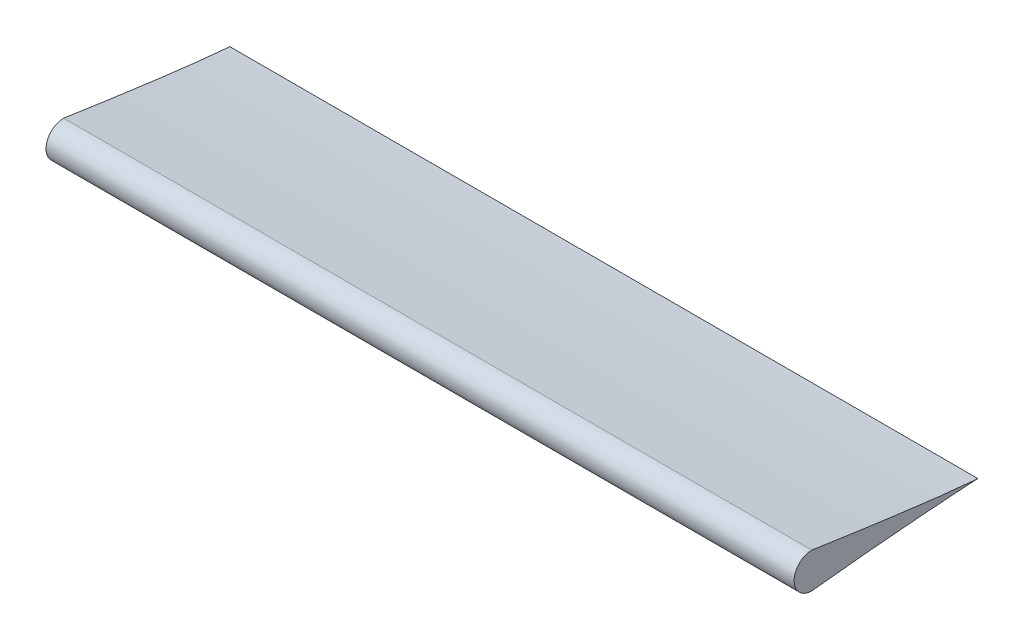
ISO-10303-21;
HEADER;
FILE_DESCRIPTION(('STEP AP214'),'2;1');
FILE_NAME('part.step','',(''),(''),'','','');
FILE_SCHEMA(('AUTOMOTIVE_DESIGN { 1 0 10303 214 1 1 1 1 }'));
ENDSEC;
DATA;
#1=APPLICATION_CONTEXT('core data for automotive mechanical design processes');
#2=APPLICATION_PROTOCOL_DEFINITION('international standard','automotive_design',2000,#1);
#3=PRODUCT_CONTEXT('',#1,'mechanical');
#4=PRODUCT('Part','Part','',(#3));
#5=PRODUCT_RELATED_PRODUCT_CATEGORY('part','',(#4));
#6=PRODUCT_DEFINITION_FORMATION('','',#4);
#7=PRODUCT_DEFINITION_CONTEXT('part definition',#1,'design');
#8=PRODUCT_DEFINITION('design','',#6,#7);
#9=PRODUCT_DEFINITION_SHAPE('','',#8);
#10=(LENGTH_UNIT() NAMED_UNIT(*) SI_UNIT(.MILLI.,.METRE.));
#11=(NAMED_UNIT(*) PLANE_ANGLE_UNIT() SI_UNIT($,.RADIAN.));
#12=(NAMED_UNIT(*) SI_UNIT($,.STERADIAN.) SOLID_ANGLE_UNIT());
#13=UNCERTAINTY_MEASURE_WITH_UNIT(LENGTH_MEASURE(1.E-05),#10,'distance_accuracy_value','');
#14=(GEOMETRIC_REPRESENTATION_CONTEXT(3) GLOBAL_UNCERTAINTY_ASSIGNED_CONTEXT((#13)) GLOBAL_UNIT_ASSIGNED_CONTEXT((#10,
#11,#12)) REPRESENTATION_CONTEXT('',''));
#15=CARTESIAN_POINT('',(0.,0.,0.));
#16=DIRECTION('',(0.,0.,1.));
#17=DIRECTION('',(1.,0.,0.));
#18=AXIS2_PLACEMENT_3D('',#15,#16,#17);
#19=CARTESIAN_POINT('',(-1040.,2.7242380078239,-0.666894321440181));
#20=DIRECTION('',(-1.,0.,0.));
#21=DIRECTION('',(0.,0.,1.));
#22=AXIS2_PLACEMENT_3D('',#19,#20,#21);
#23=PLANE('',#22);
#24=CARTESIAN_POINT('',(-1040.,5.86071638027736,-346.600000000001));
#25=CARTESIAN_POINT('',(-1040.,5.86942153305414,-346.597852480932));
#26=CARTESIAN_POINT('',(-1040.,5.95408700484384,-345.167167538133));
#27=CARTESIAN_POINT('',(-1040.,6.12770380231337,-343.71030351356));
#28=CARTESIAN_POINT('',(-1040.,6.43081864272421,-340.207816876405));
#29=CARTESIAN_POINT('',(-1040.,6.87325921714072,-335.907670847587));
#30=CARTESIAN_POINT('',(-1040.,7.49275086256784,-330.292953697324));
#31=CARTESIAN_POINT('',(-1040.,8.2740844505515,-323.659553652556));
#32=CARTESIAN_POINT('',(-1040.,9.24327014430082,-316.002511078225));
#33=CARTESIAN_POINT('',(-1040.,10.3815705655346,-307.429551377501));
#34=CARTESIAN_POINT('',(-1040.,11.6833030342219,-298.018680009203));
#35=CARTESIAN_POINT('',(-1040.,13.1368804000074,-287.863702409179));
#36=CARTESIAN_POINT('',(-1040.,14.7182033722859,-277.059643778127));
#37=CARTESIAN_POINT('',(-1040.,16.4008254095122,-265.704765677718));
#38=CARTESIAN_POINT('',(-1040.,18.1406788919494,-253.896097473474));
#39=CARTESIAN_POINT('',(-1040.,19.9192377434933,-241.737250017814));
#40=CARTESIAN_POINT('',(-1040.,21.6563318290564,-229.327440834419));
#41=CARTESIAN_POINT('',(-1040.,23.3337080476179,-216.762528701424));
#42=CARTESIAN_POINT('',(-1040.,24.7772271585556,-204.073884670746));
#43=CARTESIAN_POINT('',(-1040.,25.9228413259878,-191.282522577713));
#44=CARTESIAN_POINT('',(-1040.,26.8745966143027,-178.425425999593));
#45=CARTESIAN_POINT('',(-1040.,27.5954369967736,-165.549012826765));
#46=CARTESIAN_POINT('',(-1040.,28.088486879693,-152.725859519747));
#47=CARTESIAN_POINT('',(-1040.,28.3788067662138,-140.023357060786));
#48=CARTESIAN_POINT('',(-1040.,28.4385181896698,-127.510045631155));
#49=CARTESIAN_POINT('',(-1040.,28.2957815085234,-115.254313713338));
#50=CARTESIAN_POINT('',(-1040.,27.9345770933286,-103.323214561727));
#51=CARTESIAN_POINT('',(-1040.,27.377464880577,-91.7878334113469));
#52=CARTESIAN_POINT('',(-1040.,26.6199481784096,-80.7121418120204));
#53=CARTESIAN_POINT('',(-1040.,25.6837634702586,-70.1628154750461));
#54=CARTESIAN_POINT('',(-1040.,24.5593112665133,-60.2034081504018));
#55=CARTESIAN_POINT('',(-1040.,23.2663130962177,-50.8913221894429));
#56=CARTESIAN_POINT('',(-1040.,21.7863228253272,-42.2808453554841));
#57=CARTESIAN_POINT('',(-1040.,20.1573279635737,-34.4120212721913));
#58=CARTESIAN_POINT('',(-1040.,18.335760386343,-27.3199916589574));
#59=CARTESIAN_POINT('',(-1040.,16.3210120421331,-21.030633492362));
#60=CARTESIAN_POINT('',(-1040.,14.2018530313749,-15.5314824382831));
#61=CARTESIAN_POINT('',(-1040.,11.9569242277192,-10.8536593210112));
#62=CARTESIAN_POINT('',(-1040.,9.65350487933525,-7.00869240132422));
#63=CARTESIAN_POINT('',(-1040.,7.32149117441311,-3.99127209384448));
#64=CARTESIAN_POINT('',(-1040.,4.91734468115579,-1.82192325647609));
#65=CARTESIAN_POINT('',(-1040.,2.58232434229022,-0.523442799864354));
#66=CARTESIAN_POINT('',(-1040.,0.409759015467248,0.233627416068555));
#67=CARTESIAN_POINT('',(-1040.,-1.75709273500441,-0.426579477064093));
#68=CARTESIAN_POINT('',(-1040.,-3.1977483365444,-2.53791233705558));
#69=CARTESIAN_POINT('',(-1040.,-4.65483807131861,-5.3921114462632));
#70=CARTESIAN_POINT('',(-1040.,-6.05472613804281,-9.30647814844361));
#71=CARTESIAN_POINT('',(-1040.,-7.37535584141191,-14.1602854101434));
#72=CARTESIAN_POINT('',(-1040.,-8.59209450318432,-19.955205746287));
#73=CARTESIAN_POINT('',(-1040.,-9.67784910590047,-26.6510377888111));
#74=CARTESIAN_POINT('',(-1040.,-10.6303869203228,-34.2149896306284));
#75=CARTESIAN_POINT('',(-1040.,-11.4362358704924,-42.6095526598738));
#76=CARTESIAN_POINT('',(-1040.,-12.0917115028123,-51.7866503013561));
#77=CARTESIAN_POINT('',(-1040.,-12.6014398459628,-61.6964853282173));
#78=CARTESIAN_POINT('',(-1040.,-12.9578854769249,-72.2808050911164));
#79=CARTESIAN_POINT('',(-1040.,-13.1648826289751,-83.4794397444211));
#80=CARTESIAN_POINT('',(-1040.,-13.2211833311955,-95.2244179207898));
#81=CARTESIAN_POINT('',(-1040.,-13.1327984404319,-107.44531563697));
#82=CARTESIAN_POINT('',(-1040.,-12.9039422081063,-120.06718568759));
#83=CARTESIAN_POINT('',(-1040.,-12.5386131752455,-133.010375763007));
#84=CARTESIAN_POINT('',(-1040.,-12.0446708618454,-146.192016010977));
#85=CARTESIAN_POINT('',(-1040.,-11.414340745761,-159.52633158202));
#86=CARTESIAN_POINT('',(-1040.,-10.6584041848464,-172.924472517881));
#87=CARTESIAN_POINT('',(-1040.,-9.72862479746972,-186.316724917838));
#88=CARTESIAN_POINT('',(-1040.,-8.59584787560952,-199.652839070497));
#89=CARTESIAN_POINT('',(-1040.,-7.3129207995109,-212.898223931713));
#90=CARTESIAN_POINT('',(-1040.,-5.91694220775768,-226.003657754342));
#91=CARTESIAN_POINT('',(-1040.,-4.45292645217377,-238.897774799766));
#92=CARTESIAN_POINT('',(-1040.,-2.98628782761945,-251.506843629765));
#93=CARTESIAN_POINT('',(-1040.,-1.56237335714104,-263.735084655258));
#94=CARTESIAN_POINT('',(-1040.,-0.237986920124389,-275.482068230199));
#95=CARTESIAN_POINT('',(-1040.,0.967497871551593,-286.637141689727));
#96=CARTESIAN_POINT('',(-1040.,2.03372814092395,-297.094147692606));
#97=CARTESIAN_POINT('',(-1040.,2.94760216572376,-306.753882210194));
#98=CARTESIAN_POINT('',(-1040.,3.71094189693205,-315.518201790493));
#99=CARTESIAN_POINT('',(-1040.,4.33761076632527,-323.308156110828));
#100=CARTESIAN_POINT('',(-1040.,4.82578782510346,-330.021729474098));
#101=CARTESIAN_POINT('',(-1040.,5.21956178896965,-335.69003557838));
#102=CARTESIAN_POINT('',(-1040.,5.55182594115489,-340.042163058898));
#103=CARTESIAN_POINT('',(-1040.,5.75757542524674,-343.623905570646));
#104=CARTESIAN_POINT('',(-1040.,5.87005572151089,-345.115045904188));
#105=CARTESIAN_POINT('',(-1040.,5.85182687726858,-346.602192997381));
#106=CARTESIAN_POINT('',(-1040.,5.86071638027736,-346.600000000001));
#107=B_SPLINE_CURVE_WITH_KNOTS('',3,(#24,#25,#26,#27,#28,#29,#30,#31,#32,#33,#34,#35,#36,#37,
#38,#39,#40,#41,#42,#43,#44,#45,#46,#47,#48,#49,#50,#51,#52,#53,#54,#55,#56,#57,#58,#59,#60,#61,
#62,#63,#64,#65,#66,#67,#68,#69,#70,#71,#72,#73,#74,#75,#76,#77,#78,#79,#80,#81,#82,#83,#84,#85,
#86,#87,#88,#89,#90,#91,#92,#93,#94,#95,#96,#97,#98,#99,#100,#101,#102,#103,#104,#105,#106),
.UNSPECIFIED.,.T.,.F.,(4,1,1,1,1,1,1,1,1,1,1,1,1,1,1,1,1,1,1,1,1,1,1,1,1,1,1,1,1,1,1,1,1,1,1,1,
1,1,1,1,1,1,1,1,1,1,1,1,1,1,1,1,1,1,1,1,1,1,1,1,1,1,1,1,1,1,1,1,1,1,1,1,1,1,1,1,1,1,1,1,4),(0.,
0.000971237958935089,0.00379550488941406,0.00838889713311412,0.0147108585341679,
0.0226780451151255,0.0321935893654122,0.0431578374772158,0.0554477635765267,0.0689450810748732,
0.0835209743295518,0.0990345049396833,0.115338149300278,0.132292378261073,0.149748787287016,
0.167548160817062,0.185533000847794,0.203606824322396,0.221802152219981,0.240094780419079,
0.258381325545334,0.276593840485898,0.294615696320151,0.312363136598153,0.329758285552068,
0.34668867666744,0.363076304230722,0.378823915995178,0.393853850968574,0.408070676422894,
0.421404123740081,0.433792847882556,0.445184773052429,0.455537591190034,0.464887425285465,
0.473229998593558,0.480557633281548,0.486906623799577,0.492238034051424,0.496718364977629,
0.500526341599145,0.503606091199367,0.506177592628953,0.509478573363382,0.514052138731787,
0.519911011985978,0.527046393100711,0.535434514860353,0.545049400456516,0.555862282514593,
0.56781964692456,0.58087606000333,0.594950040868561,0.609977749598367,0.625870112949949,
0.642537246695213,0.659878939874303,0.677794441934522,0.696172799529494,0.714892973853184,
0.733838964579521,0.752890035469179,0.771908418749841,0.790874705845988,0.809754599599678,
0.828447710464764,0.846871330730811,0.864890849052298,0.882382263972322,0.89917761398861,
0.915117479075331,0.930053399369896,0.943838005379903,0.956340240690094,0.967439356026097,
0.977019226998307,0.985009700423928,0.991382470548144,0.996091139759218,0.999008193999625,1.),.UNSPECIFIED.);
#108=CARTESIAN_POINT('',(-1040.,-0.0490741662546035,-277.280000000001));
#109=VERTEX_POINT('',#108);
#110=CARTESIAN_POINT('',(-1040.,14.6891266400672,-277.280000000001));
#111=VERTEX_POINT('',#110);
#112=EDGE_CURVE('E15',#109,#111,#107,.T.);
#113=ORIENTED_EDGE('',*,*,#112,.F.);
#114=CARTESIAN_POINT('',(-1040.,7.32002623690636,-277.280000000001));
#115=DIRECTION('',(-1.,0.,0.));
#116=DIRECTION('',(0.,0.,1.));
#117=AXIS2_PLACEMENT_3D('',#114,#115,#116);
#118=CIRCLE('',#117,7.36910040316079);
#119=EDGE_CURVE('E146',#109,#111,#118,.T.);
#120=ORIENTED_EDGE('',*,*,#119,.T.);
#121=EDGE_LOOP('',(#113,#120));
#122=FACE_BOUND('',#121,.T.);
#123=ADVANCED_FACE('F100',(#122),#23,.T.);
#124=CARTESIAN_POINT('',(1040.,5.86071638027729,-346.600000000002));
#125=CARTESIAN_POINT('',(1040.,5.86942153305407,-346.597852480933));
#126=CARTESIAN_POINT('',(1040.,5.95408700484373,-345.167167538133));
#127=CARTESIAN_POINT('',(1040.,6.12770380231326,-343.71030351356));
#128=CARTESIAN_POINT('',(1040.,6.4308186427241,-340.207816876405));
#129=CARTESIAN_POINT('',(1040.,6.87325921714055,-335.907670847587));
#130=CARTESIAN_POINT('',(1040.,7.49275086256784,-330.292953697324));
#131=CARTESIAN_POINT('',(1040.,8.27408445055139,-323.659553652556));
#132=CARTESIAN_POINT('',(1040.,9.24327014430082,-316.002511078225));
#133=CARTESIAN_POINT('',(1040.,10.3815705655345,-307.429551377501));
#134=CARTESIAN_POINT('',(1040.,11.6833030342218,-298.018680009203));
#135=CARTESIAN_POINT('',(1040.,13.1368804000073,-287.863702409179));
#136=CARTESIAN_POINT('',(1040.,14.7182033722859,-277.059643778127));
#137=CARTESIAN_POINT('',(1040.,16.4008254095122,-265.704765677718));
#138=CARTESIAN_POINT('',(1040.,18.1406788919493,-253.896097473474));
#139=CARTESIAN_POINT('',(1040.,19.9192377434932,-241.737250017814));
#140=CARTESIAN_POINT('',(1040.,21.6563318290564,-229.327440834419));
#141=CARTESIAN_POINT('',(1040.,23.3337080476178,-216.762528701424));
#142=CARTESIAN_POINT('',(1040.,24.7772271585557,-204.073884670746));
#143=CARTESIAN_POINT('',(1040.,25.9228413259878,-191.282522577714));
#144=CARTESIAN_POINT('',(1040.,26.8745966143026,-178.425425999593));
#145=CARTESIAN_POINT('',(1040.,27.5954369967736,-165.549012826765));
#146=CARTESIAN_POINT('',(1040.,28.088486879693,-152.725859519747));
#147=CARTESIAN_POINT('',(1040.,28.3788067662139,-140.023357060786));
#148=CARTESIAN_POINT('',(1040.,28.4385181896697,-127.510045631155));
#149=CARTESIAN_POINT('',(1040.,28.2957815085232,-115.254313713338));
#150=CARTESIAN_POINT('',(1040.,27.9345770933286,-103.323214561727));
#151=CARTESIAN_POINT('',(1040.,27.3774648805769,-91.7878334113468));
#152=CARTESIAN_POINT('',(1040.,26.6199481784094,-80.7121418120204));
#153=CARTESIAN_POINT('',(1040.,25.6837634702586,-70.1628154750461));
#154=CARTESIAN_POINT('',(1040.,24.5593112665133,-60.2034081504018));
#155=CARTESIAN_POINT('',(1040.,23.2663130962176,-50.8913221894429));
#156=CARTESIAN_POINT('',(1040.,21.7863228253272,-42.280845355484));
#157=CARTESIAN_POINT('',(1040.,20.1573279635737,-34.4120212721913));
#158=CARTESIAN_POINT('',(1040.,18.3357603863429,-27.3199916589574));
#159=CARTESIAN_POINT('',(1040.,16.321012042133,-21.0306334923619));
#160=CARTESIAN_POINT('',(1040.,14.2018530313748,-15.5314824382831));
#161=CARTESIAN_POINT('',(1040.,11.956924227719,-10.8536593210113));
#162=CARTESIAN_POINT('',(1040.,9.65350487933514,-7.00869240132422));
#163=CARTESIAN_POINT('',(1040.,7.32149117441311,-3.99127209384448));
#164=CARTESIAN_POINT('',(1040.,4.91734468115568,-1.82192325647609));
#165=CARTESIAN_POINT('',(1040.,2.58232434229011,-0.523442799864354));
#166=CARTESIAN_POINT('',(1040.,0.409759015467137,0.233627416068555));
#167=CARTESIAN_POINT('',(1040.,-1.75709273500441,-0.426579477063926));
#168=CARTESIAN_POINT('',(1040.,-3.19774833654451,-2.53791233705558));
#169=CARTESIAN_POINT('',(1040.,-4.65483807131872,-5.39211144626317));
#170=CARTESIAN_POINT('',(1040.,-6.05472613804292,-9.30647814844365));
#171=CARTESIAN_POINT('',(1040.,-7.37535584141202,-14.1602854101434));
#172=CARTESIAN_POINT('',(1040.,-8.59209450318427,-19.9552057462871));
#173=CARTESIAN_POINT('',(1040.,-9.67784910590047,-26.6510377888111));
#174=CARTESIAN_POINT('',(1040.,-10.6303869203227,-34.2149896306284));
#175=CARTESIAN_POINT('',(1040.,-11.4362358704925,-42.6095526598737));
#176=CARTESIAN_POINT('',(1040.,-12.0917115028124,-51.7866503013561));
#177=CARTESIAN_POINT('',(1040.,-12.6014398459628,-61.6964853282173));
#178=CARTESIAN_POINT('',(1040.,-12.9578854769251,-72.2808050911164));
#179=CARTESIAN_POINT('',(1040.,-13.1648826289751,-83.4794397444211));
#180=CARTESIAN_POINT('',(1040.,-13.2211833311955,-95.2244179207898));
#181=CARTESIAN_POINT('',(1040.,-13.132798440432,-107.445315636969));
#182=CARTESIAN_POINT('',(1040.,-12.9039422081063,-120.06718568759));
#183=CARTESIAN_POINT('',(1040.,-12.5386131752456,-133.010375763007));
#184=CARTESIAN_POINT('',(1040.,-12.0446708618454,-146.192016010977));
#185=CARTESIAN_POINT('',(1040.,-11.4143407457611,-159.52633158202));
#186=CARTESIAN_POINT('',(1040.,-10.6584041848465,-172.924472517881));
#187=CARTESIAN_POINT('',(1040.,-9.72862479746972,-186.316724917838));
#188=CARTESIAN_POINT('',(1040.,-8.59584787560963,-199.652839070497));
#189=CARTESIAN_POINT('',(1040.,-7.31292079951085,-212.898223931713));
#190=CARTESIAN_POINT('',(1040.,-5.91694220775768,-226.003657754342));
#191=CARTESIAN_POINT('',(1040.,-4.45292645217388,-238.897774799766));
#192=CARTESIAN_POINT('',(1040.,-2.98628782761956,-251.506843629765));
#193=CARTESIAN_POINT('',(1040.,-1.56237335714116,-263.735084655258));
#194=CARTESIAN_POINT('',(1040.,-0.237986920124444,-275.482068230199));
#195=CARTESIAN_POINT('',(1040.,0.967497871551481,-286.637141689727));
#196=CARTESIAN_POINT('',(1040.,2.03372814092395,-297.094147692606));
#197=CARTESIAN_POINT('',(1040.,2.94760216572376,-306.753882210194));
#198=CARTESIAN_POINT('',(1040.,3.71094189693194,-315.518201790493));
#199=CARTESIAN_POINT('',(1040.,4.33761076632516,-323.308156110828));
#200=CARTESIAN_POINT('',(1040.,4.82578782510334,-330.021729474099));
#201=CARTESIAN_POINT('',(1040.,5.21956178896954,-335.69003557838));
#202=CARTESIAN_POINT('',(1040.,5.55182594115478,-340.042163058898));
#203=CARTESIAN_POINT('',(1040.,5.75757542524663,-343.623905570646));
#204=CARTESIAN_POINT('',(1040.,5.87005572151078,-345.115045904188));
#205=CARTESIAN_POINT('',(1040.,5.85182687726851,-346.602192997381));
#206=CARTESIAN_POINT('',(1040.,5.86071638027729,-346.600000000002));
#207=B_SPLINE_CURVE_WITH_KNOTS('',3,(#124,#125,#126,#127,#128,#129,#130,#131,#132,#133,#134,
#135,#136,#137,#138,#139,#140,#141,#142,#143,#144,#145,#146,#147,#148,#149,#150,#151,#152,#153,
#154,#155,#156,#157,#158,#159,#160,#161,#162,#163,#164,#165,#166,#167,#168,#169,#170,#171,#172,
#173,#174,#175,#176,#177,#178,#179,#180,#181,#182,#183,#184,#185,#186,#187,#188,#189,#190,#191,
#192,#193,#194,#195,#196,#197,#198,#199,#200,#201,#202,#203,#204,#205,#206),.UNSPECIFIED.,.T.,
.F.,(4,1,1,1,1,1,1,1,1,1,1,1,1,1,1,1,1,1,1,1,1,1,1,1,1,1,1,1,1,1,1,1,1,1,1,1,1,1,1,1,1,1,1,1,1,
1,1,1,1,1,1,1,1,1,1,1,1,1,1,1,1,1,1,1,1,1,1,1,1,1,1,1,1,1,1,1,1,1,1,1,4),(0.,
0.000971237958935089,0.00379550488941406,0.00838889713311412,0.0147108585341679,
0.0226780451151255,0.0321935893654122,0.0431578374772158,0.0554477635765267,0.0689450810748732,
0.0835209743295518,0.0990345049396833,0.115338149300278,0.132292378261073,0.149748787287016,
0.167548160817062,0.185533000847794,0.203606824322396,0.221802152219981,0.240094780419079,
0.258381325545334,0.276593840485898,0.294615696320151,0.312363136598153,0.329758285552068,
0.34668867666744,0.363076304230722,0.378823915995178,0.393853850968574,0.408070676422894,
0.421404123740081,0.433792847882556,0.445184773052429,0.455537591190034,0.464887425285465,
0.473229998593558,0.480557633281548,0.486906623799577,0.492238034051424,0.496718364977629,
0.500526341599145,0.503606091199367,0.506177592628953,0.509478573363382,0.514052138731787,
0.519911011985978,0.527046393100711,0.535434514860353,0.545049400456516,0.555862282514593,
0.56781964692456,0.58087606000333,0.594950040868561,0.609977749598367,0.625870112949949,
0.642537246695213,0.659878939874303,0.677794441934522,0.696172799529494,0.714892973853184,
0.733838964579521,0.752890035469179,0.771908418749841,0.790874705845988,0.809754599599678,
0.828447710464764,0.846871330730811,0.864890849052298,0.882382263972322,0.89917761398861,
0.915117479075331,0.930053399369896,0.943838005379903,0.956340240690094,0.967439356026097,
0.977019226998307,0.985009700423928,0.991382470548144,0.996091139759218,0.999008193999625,1.),.UNSPECIFIED.);
#208=DIRECTION('',(-1.,0.,0.));
#209=VECTOR('',#208,1.);
#210=SURFACE_OF_LINEAR_EXTRUSION('',#207,#209);
#211=CARTESIAN_POINT('',(-728.,5.86071638027741,-346.600000000001));
#212=CARTESIAN_POINT('',(-728.,5.8694215330542,-346.597852480932));
#213=CARTESIAN_POINT('',(-728.,5.9540870048439,-345.167167538133));
#214=CARTESIAN_POINT('',(-728.,6.12770380231337,-343.71030351356));
#215=CARTESIAN_POINT('',(-728.,6.43081864272421,-340.207816876405));
#216=CARTESIAN_POINT('',(-728.,6.87325921714072,-335.907670847587));
#217=CARTESIAN_POINT('',(-728.,7.49275086256784,-330.292953697324));
#218=CARTESIAN_POINT('',(-728.,8.27408445055156,-323.659553652556));
#219=CARTESIAN_POINT('',(-728.,9.24327014430087,-316.002511078225));
#220=CARTESIAN_POINT('',(-728.,10.3815705655346,-307.429551377501));
#221=CARTESIAN_POINT('',(-728.,11.683303034222,-298.018680009203));
#222=CARTESIAN_POINT('',(-728.,13.1368804000074,-287.863702409179));
#223=CARTESIAN_POINT('',(-728.,14.7182033722859,-277.059643778127));
#224=CARTESIAN_POINT('',(-728.,16.4008254095123,-265.704765677718));
#225=CARTESIAN_POINT('',(-728.,18.1406788919495,-253.896097473474));
#226=CARTESIAN_POINT('',(-728.,19.9192377434933,-241.737250017814));
#227=CARTESIAN_POINT('',(-728.,21.6563318290564,-229.327440834419));
#228=CARTESIAN_POINT('',(-728.,23.3337080476179,-216.762528701424));
#229=CARTESIAN_POINT('',(-728.,24.7772271585557,-204.073884670746));
#230=CARTESIAN_POINT('',(-728.,25.9228413259879,-191.282522577713));
#231=CARTESIAN_POINT('',(-728.,26.8745966143027,-178.425425999593));
#232=CARTESIAN_POINT('',(-728.,27.5954369967736,-165.549012826765));
#233=CARTESIAN_POINT('',(-728.,28.088486879693,-152.725859519747));
#234=CARTESIAN_POINT('',(-728.,28.3788067662139,-140.023357060786));
#235=CARTESIAN_POINT('',(-728.,28.4385181896698,-127.510045631155));
#236=CARTESIAN_POINT('',(-728.,28.2957815085233,-115.254313713338));
#237=CARTESIAN_POINT('',(-728.,27.9345770933286,-103.323214561727));
#238=CARTESIAN_POINT('',(-728.,27.377464880577,-91.7878334113468));
#239=CARTESIAN_POINT('',(-728.,26.6199481784095,-80.7121418120204));
#240=CARTESIAN_POINT('',(-728.,25.6837634702586,-70.1628154750462));
#241=CARTESIAN_POINT('',(-728.,24.5593112665133,-60.2034081504018));
#242=CARTESIAN_POINT('',(-728.,23.2663130962177,-50.8913221894429));
#243=CARTESIAN_POINT('',(-728.,21.7863228253272,-42.280845355484));
#244=CARTESIAN_POINT('',(-728.,20.1573279635737,-34.4120212721913));
#245=CARTESIAN_POINT('',(-728.,18.335760386343,-27.3199916589574));
#246=CARTESIAN_POINT('',(-728.,16.321012042133,-21.0306334923619));
#247=CARTESIAN_POINT('',(-728.,14.201853031375,-15.531482438283));
#248=CARTESIAN_POINT('',(-728.,11.9569242277192,-10.8536593210113));
#249=CARTESIAN_POINT('',(-728.,9.65350487933531,-7.00869240132422));
#250=CARTESIAN_POINT('',(-728.,7.32149117441311,-3.99127209384453));
#251=CARTESIAN_POINT('',(-728.,4.91734468115584,-1.82192325647618));
#252=CARTESIAN_POINT('',(-728.,2.58232434229028,-0.52344279986416));
#253=CARTESIAN_POINT('',(-728.,0.409759015467304,0.23362741606836));
#254=CARTESIAN_POINT('',(-728.,-1.75709273500441,-0.42657947706401));
#255=CARTESIAN_POINT('',(-728.,-3.19774833654446,-2.53791233705558));
#256=CARTESIAN_POINT('',(-728.,-4.65483807131861,-5.39211144626312));
#257=CARTESIAN_POINT('',(-728.,-6.05472613804281,-9.30647814844365));
#258=CARTESIAN_POINT('',(-728.,-7.37535584141191,-14.1602854101434));
#259=CARTESIAN_POINT('',(-728.,-8.59209450318427,-19.9552057462871));
#260=CARTESIAN_POINT('',(-728.,-9.67784910590047,-26.651037788811));
#261=CARTESIAN_POINT('',(-728.,-10.6303869203227,-34.2149896306284));
#262=CARTESIAN_POINT('',(-728.,-11.4362358704924,-42.6095526598738));
#263=CARTESIAN_POINT('',(-728.,-12.0917115028122,-51.7866503013561));
#264=CARTESIAN_POINT('',(-728.,-12.6014398459627,-61.6964853282172));
#265=CARTESIAN_POINT('',(-728.,-12.9578854769249,-72.2808050911164));
#266=CARTESIAN_POINT('',(-728.,-13.164882628975,-83.4794397444211));
#267=CARTESIAN_POINT('',(-728.,-13.2211833311955,-95.2244179207898));
#268=CARTESIAN_POINT('',(-728.,-13.1327984404319,-107.44531563697));
#269=CARTESIAN_POINT('',(-728.,-12.9039422081062,-120.06718568759));
#270=CARTESIAN_POINT('',(-728.,-12.5386131752455,-133.010375763007));
#271=CARTESIAN_POINT('',(-728.,-12.0446708618454,-146.192016010977));
#272=CARTESIAN_POINT('',(-728.,-11.414340745761,-159.52633158202));
#273=CARTESIAN_POINT('',(-728.,-10.6584041848464,-172.924472517881));
#274=CARTESIAN_POINT('',(-728.,-9.72862479746972,-186.316724917838));
#275=CARTESIAN_POINT('',(-728.,-8.59584787560946,-199.652839070497));
#276=CARTESIAN_POINT('',(-728.,-7.31292079951085,-212.898223931713));
#277=CARTESIAN_POINT('',(-728.,-5.91694220775768,-226.003657754342));
#278=CARTESIAN_POINT('',(-728.,-4.45292645217371,-238.897774799766));
#279=CARTESIAN_POINT('',(-728.,-2.98628782761945,-251.506843629765));
#280=CARTESIAN_POINT('',(-728.,-1.56237335714099,-263.735084655259));
#281=CARTESIAN_POINT('',(-728.,-0.237986920124444,-275.482068230199));
#282=CARTESIAN_POINT('',(-728.,0.967497871551593,-286.637141689727));
#283=CARTESIAN_POINT('',(-728.,2.03372814092401,-297.094147692606));
#284=CARTESIAN_POINT('',(-728.,2.94760216572382,-306.753882210194));
#285=CARTESIAN_POINT('',(-728.,3.71094189693194,-315.518201790493));
#286=CARTESIAN_POINT('',(-728.,4.33761076632527,-323.308156110828));
#287=CARTESIAN_POINT('',(-728.,4.82578782510346,-330.021729474098));
#288=CARTESIAN_POINT('',(-728.,5.21956178896965,-335.69003557838));
#289=CARTESIAN_POINT('',(-728.,5.55182594115494,-340.042163058898));
#290=CARTESIAN_POINT('',(-728.,5.75757542524669,-343.623905570646));
#291=CARTESIAN_POINT('',(-728.,5.87005572151095,-345.115045904188));
#292=CARTESIAN_POINT('',(-728.,5.85182687726863,-346.60219299738));
#293=CARTESIAN_POINT('',(-728.,5.86071638027741,-346.600000000001));
#294=B_SPLINE_CURVE_WITH_KNOTS('',3,(#211,#212,#213,#214,#215,#216,#217,#218,#219,#220,#221,
#222,#223,#224,#225,#226,#227,#228,#229,#230,#231,#232,#233,#234,#235,#236,#237,#238,#239,#240,
#241,#242,#243,#244,#245,#246,#247,#248,#249,#250,#251,#252,#253,#254,#255,#256,#257,#258,#259,
#260,#261,#262,#263,#264,#265,#266,#267,#268,#269,#270,#271,#272,#273,#274,#275,#276,#277,#278,
#279,#280,#281,#282,#283,#284,#285,#286,#287,#288,#289,#290,#291,#292,#293),.UNSPECIFIED.,.T.,
.F.,(4,1,1,1,1,1,1,1,1,1,1,1,1,1,1,1,1,1,1,1,1,1,1,1,1,1,1,1,1,1,1,1,1,1,1,1,1,1,1,1,1,1,1,1,1,
1,1,1,1,1,1,1,1,1,1,1,1,1,1,1,1,1,1,1,1,1,1,1,1,1,1,1,1,1,1,1,1,1,1,1,4),(0.,
0.000971237958935089,0.00379550488941406,0.00838889713311412,0.0147108585341679,
0.0226780451151255,0.0321935893654122,0.0431578374772158,0.0554477635765267,0.0689450810748732,
0.0835209743295518,0.0990345049396833,0.115338149300278,0.132292378261073,0.149748787287016,
0.167548160817062,0.185533000847794,0.203606824322396,0.221802152219981,0.240094780419079,
0.258381325545334,0.276593840485898,0.294615696320151,0.312363136598153,0.329758285552068,
0.34668867666744,0.363076304230722,0.378823915995178,0.393853850968574,0.408070676422894,
0.421404123740081,0.433792847882556,0.445184773052429,0.455537591190034,0.464887425285465,
0.473229998593558,0.480557633281548,0.486906623799577,0.492238034051424,0.496718364977629,
0.500526341599145,0.503606091199367,0.506177592628953,0.509478573363382,0.514052138731787,
0.519911011985978,0.527046393100711,0.535434514860353,0.545049400456516,0.555862282514593,
0.56781964692456,0.58087606000333,0.594950040868561,0.609977749598367,0.625870112949949,
0.642537246695213,0.659878939874303,0.677794441934522,0.696172799529494,0.714892973853184,
0.733838964579521,0.752890035469179,0.771908418749841,0.790874705845988,0.809754599599678,
0.828447710464764,0.846871330730811,0.864890849052298,0.882382263972322,0.89917761398861,
0.915117479075331,0.930053399369896,0.943838005379903,0.956340240690094,0.967439356026097,
0.977019226998307,0.985009700423928,0.991382470548144,0.996091139759218,0.999008193999625,1.),.UNSPECIFIED.);
#295=CARTESIAN_POINT('',(-728.,14.6891266400672,-277.280000000001));
#296=VERTEX_POINT('',#295);
#297=CARTESIAN_POINT('',(-728.,5.86071638027735,-346.600009514084));
#298=VERTEX_POINT('',#297);
#299=EDGE_CURVE('E128',#296,#298,#294,.F.);
#300=ORIENTED_EDGE('',*,*,#299,.T.);
#301=DIRECTION('',(0.,1.,0.));
#302=VECTOR('',#301,1.);
#303=CARTESIAN_POINT('',(-728.,-13.2211833311952,-346.600009514084));
#304=LINE('',#303,#302);
#305=CARTESIAN_POINT('',(-728.,5.8606395446601,-346.600009514085));
#306=VERTEX_POINT('',#305);
#307=EDGE_CURVE('E140',#306,#298,#304,.T.);
#308=ORIENTED_EDGE('',*,*,#307,.F.);
#309=CARTESIAN_POINT('',(-728.,-0.0490741662546035,-277.280000000001));
#310=VERTEX_POINT('',#309);
#311=EDGE_CURVE('E105',#306,#310,#294,.F.);
#312=ORIENTED_EDGE('',*,*,#311,.T.);
#313=DIRECTION('',(-1.,0.,0.));
#314=VECTOR('',#313,1.);
#315=CARTESIAN_POINT('',(-728.,-0.0490741662546035,-277.280000000001));
#316=LINE('',#315,#314);
#317=EDGE_CURVE('E156',#310,#109,#316,.T.);
#318=ORIENTED_EDGE('',*,*,#317,.T.);
#319=ORIENTED_EDGE('',*,*,#112,.T.);
#320=DIRECTION('',(-1.,0.,0.));
#321=VECTOR('',#320,1.);
#322=CARTESIAN_POINT('',(-728.,14.6891266400672,-277.280000000001));
#323=LINE('',#322,#321);
#324=EDGE_CURVE('E114',#296,#111,#323,.T.);
#325=ORIENTED_EDGE('',*,*,#324,.F.);
#326=EDGE_LOOP('',(#300,#308,#312,#318,#319,#325));
#327=FACE_BOUND('',#326,.T.);
#328=ADVANCED_FACE('F102',(#327),#210,.F.);
#329=CARTESIAN_POINT('',(-728.,7.32002623690642,-277.280000000001));
#330=DIRECTION('',(-1.,0.,0.));
#331=DIRECTION('',(0.,0.,1.));
#332=AXIS2_PLACEMENT_3D('',#329,#330,#331);
#333=CYLINDRICAL_SURFACE('',#332,7.36910040316079);
#334=ORIENTED_EDGE('',*,*,#119,.F.);
#335=ORIENTED_EDGE('',*,*,#317,.F.);
#336=CARTESIAN_POINT('',(-728.,7.32002623690642,-277.280000000001));
#337=DIRECTION('',(-1.,0.,0.));
#338=DIRECTION('',(0.,0.,1.));
#339=AXIS2_PLACEMENT_3D('',#336,#337,#338);
#340=CIRCLE('',#339,7.36910040316079);
#341=EDGE_CURVE('E141',#310,#296,#340,.T.);
#342=ORIENTED_EDGE('',*,*,#341,.T.);
#343=ORIENTED_EDGE('',*,*,#324,.T.);
#344=EDGE_LOOP('',(#334,#335,#342,#343));
#345=FACE_BOUND('',#344,.T.);
#346=ADVANCED_FACE('F175',(#345),#333,.T.);
#347=CARTESIAN_POINT('',(-728.,-13.2211833311953,0.0165959801472215));
#348=DIRECTION('',(-1.,0.,0.));
#349=DIRECTION('',(0.,0.,1.));
#350=AXIS2_PLACEMENT_3D('',#347,#348,#349);
#351=PLANE('',#350);
#352=ORIENTED_EDGE('',*,*,#307,.T.);
#353=ORIENTED_EDGE('',*,*,#299,.F.);
#354=ORIENTED_EDGE('',*,*,#341,.F.);
#355=ORIENTED_EDGE('',*,*,#311,.F.);
#356=EDGE_LOOP('',(#352,#353,#354,#355));
#357=FACE_BOUND('',#356,.T.);
#358=ADVANCED_FACE('F139',(#357),#351,.F.);
#359=CLOSED_SHELL('',(#123,#328,#346,#358));
#360=MANIFOLD_SOLID_BREP('B2',#359);
#361=ADVANCED_BREP_SHAPE_REPRESENTATION('',(#18,#360),#14);
#362=SHAPE_DEFINITION_REPRESENTATION(#9,#361);
ENDSEC;
END-ISO-10303-21;
